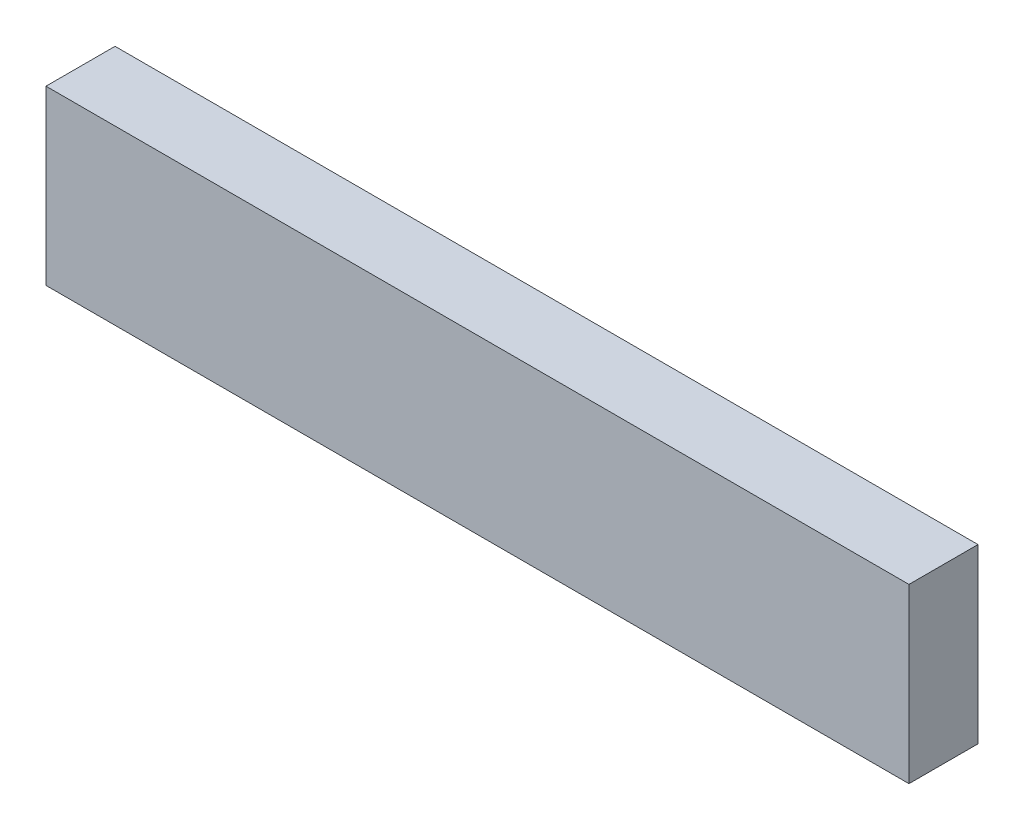
ISO-10303-21;
HEADER;
FILE_DESCRIPTION(('STEP AP214'),'2;1');
FILE_NAME('part.step','',(''),(''),'','','');
FILE_SCHEMA(('AUTOMOTIVE_DESIGN { 1 0 10303 214 1 1 1 1 }'));
ENDSEC;
DATA;
#1=APPLICATION_CONTEXT('core data for automotive mechanical design processes');
#2=APPLICATION_PROTOCOL_DEFINITION('international standard','automotive_design',2000,#1);
#3=PRODUCT_CONTEXT('',#1,'mechanical');
#4=PRODUCT('Part','Part','',(#3));
#5=PRODUCT_RELATED_PRODUCT_CATEGORY('part','',(#4));
#6=PRODUCT_DEFINITION_FORMATION('','',#4);
#7=PRODUCT_DEFINITION_CONTEXT('part definition',#1,'design');
#8=PRODUCT_DEFINITION('design','',#6,#7);
#9=PRODUCT_DEFINITION_SHAPE('','',#8);
#10=(LENGTH_UNIT() NAMED_UNIT(*) SI_UNIT(.MILLI.,.METRE.));
#11=(NAMED_UNIT(*) PLANE_ANGLE_UNIT() SI_UNIT($,.RADIAN.));
#12=(NAMED_UNIT(*) SI_UNIT($,.STERADIAN.) SOLID_ANGLE_UNIT());
#13=UNCERTAINTY_MEASURE_WITH_UNIT(LENGTH_MEASURE(1.E-05),#10,'distance_accuracy_value','');
#14=(GEOMETRIC_REPRESENTATION_CONTEXT(3) GLOBAL_UNCERTAINTY_ASSIGNED_CONTEXT((#13)) GLOBAL_UNIT_ASSIGNED_CONTEXT((#10,
#11,#12)) REPRESENTATION_CONTEXT('',''));
#15=CARTESIAN_POINT('',(0.,0.,0.));
#16=DIRECTION('',(0.,0.,1.));
#17=DIRECTION('',(1.,0.,0.));
#18=AXIS2_PLACEMENT_3D('',#15,#16,#17);
#19=CARTESIAN_POINT('',(125.,-25.,20.));
#20=DIRECTION('',(-1.,0.,0.));
#21=DIRECTION('',(0.,0.,1.));
#22=AXIS2_PLACEMENT_3D('',#19,#20,#21);
#23=PLANE('',#22);
#24=DIRECTION('',(0.,1.,0.));
#25=VECTOR('',#24,1.);
#26=CARTESIAN_POINT('',(125.,-25.,0.));
#27=LINE('',#26,#25);
#28=CARTESIAN_POINT('',(125.,-25.,0.));
#29=VERTEX_POINT('',#28);
#30=CARTESIAN_POINT('',(125.,25.,0.));
#31=VERTEX_POINT('',#30);
#32=EDGE_CURVE('E113',#29,#31,#27,.T.);
#33=ORIENTED_EDGE('',*,*,#32,.T.);
#34=DIRECTION('',(0.,0.,-1.));
#35=VECTOR('',#34,1.);
#36=CARTESIAN_POINT('',(125.,25.,20.));
#37=LINE('',#36,#35);
#38=CARTESIAN_POINT('',(125.,25.,20.));
#39=VERTEX_POINT('',#38);
#40=EDGE_CURVE('E11',#39,#31,#37,.T.);
#41=ORIENTED_EDGE('',*,*,#40,.F.);
#42=DIRECTION('',(0.,1.,0.));
#43=VECTOR('',#42,1.);
#44=CARTESIAN_POINT('',(125.,-25.,20.));
#45=LINE('',#44,#43);
#46=CARTESIAN_POINT('',(125.,-25.,20.));
#47=VERTEX_POINT('',#46);
#48=EDGE_CURVE('E97',#47,#39,#45,.T.);
#49=ORIENTED_EDGE('',*,*,#48,.F.);
#50=DIRECTION('',(0.,0.,-1.));
#51=VECTOR('',#50,1.);
#52=CARTESIAN_POINT('',(125.,-25.,20.));
#53=LINE('',#52,#51);
#54=EDGE_CURVE('E109',#47,#29,#53,.T.);
#55=ORIENTED_EDGE('',*,*,#54,.T.);
#56=EDGE_LOOP('',(#33,#41,#49,#55));
#57=FACE_BOUND('',#56,.T.);
#58=ADVANCED_FACE('F45',(#57),#23,.F.);
#59=CARTESIAN_POINT('',(-125.,25.,20.));
#60=DIRECTION('',(0.,-1.,0.));
#61=DIRECTION('',(0.,0.,-1.));
#62=AXIS2_PLACEMENT_3D('',#59,#60,#61);
#63=PLANE('',#62);
#64=DIRECTION('',(-1.,0.,0.));
#65=VECTOR('',#64,1.);
#66=CARTESIAN_POINT('',(-125.,25.,0.));
#67=LINE('',#66,#65);
#68=CARTESIAN_POINT('',(-125.,25.,0.));
#69=VERTEX_POINT('',#68);
#70=EDGE_CURVE('E102',#31,#69,#67,.T.);
#71=ORIENTED_EDGE('',*,*,#70,.T.);
#72=DIRECTION('',(0.,0.,-1.));
#73=VECTOR('',#72,1.);
#74=CARTESIAN_POINT('',(-125.,25.,20.));
#75=LINE('',#74,#73);
#76=CARTESIAN_POINT('',(-125.,25.,20.));
#77=VERTEX_POINT('',#76);
#78=EDGE_CURVE('E54',#77,#69,#75,.T.);
#79=ORIENTED_EDGE('',*,*,#78,.F.);
#80=DIRECTION('',(-1.,0.,0.));
#81=VECTOR('',#80,1.);
#82=CARTESIAN_POINT('',(-125.,25.,20.));
#83=LINE('',#82,#81);
#84=EDGE_CURVE('E92',#39,#77,#83,.T.);
#85=ORIENTED_EDGE('',*,*,#84,.F.);
#86=ORIENTED_EDGE('',*,*,#40,.T.);
#87=EDGE_LOOP('',(#71,#79,#85,#86));
#88=FACE_BOUND('',#87,.T.);
#89=ADVANCED_FACE('F101',(#88),#63,.F.);
#90=CARTESIAN_POINT('',(-125.,-25.,20.));
#91=DIRECTION('',(1.,0.,0.));
#92=DIRECTION('',(0.,0.,-1.));
#93=AXIS2_PLACEMENT_3D('',#90,#91,#92);
#94=PLANE('',#93);
#95=DIRECTION('',(0.,-1.,0.));
#96=VECTOR('',#95,1.);
#97=CARTESIAN_POINT('',(-125.,-25.,0.));
#98=LINE('',#97,#96);
#99=CARTESIAN_POINT('',(-125.,-25.,0.));
#100=VERTEX_POINT('',#99);
#101=EDGE_CURVE('E79',#69,#100,#98,.T.);
#102=ORIENTED_EDGE('',*,*,#101,.T.);
#103=DIRECTION('',(0.,0.,-1.));
#104=VECTOR('',#103,1.);
#105=CARTESIAN_POINT('',(-125.,-25.,20.));
#106=LINE('',#105,#104);
#107=CARTESIAN_POINT('',(-125.,-25.,20.));
#108=VERTEX_POINT('',#107);
#109=EDGE_CURVE('E104',#108,#100,#106,.T.);
#110=ORIENTED_EDGE('',*,*,#109,.F.);
#111=DIRECTION('',(0.,-1.,0.));
#112=VECTOR('',#111,1.);
#113=CARTESIAN_POINT('',(-125.,-25.,20.));
#114=LINE('',#113,#112);
#115=EDGE_CURVE('E95',#77,#108,#114,.T.);
#116=ORIENTED_EDGE('',*,*,#115,.F.);
#117=ORIENTED_EDGE('',*,*,#78,.T.);
#118=EDGE_LOOP('',(#102,#110,#116,#117));
#119=FACE_BOUND('',#118,.T.);
#120=ADVANCED_FACE('F105',(#119),#94,.F.);
#121=CARTESIAN_POINT('',(-125.,-25.,20.));
#122=DIRECTION('',(0.,1.,0.));
#123=DIRECTION('',(0.,0.,1.));
#124=AXIS2_PLACEMENT_3D('',#121,#122,#123);
#125=PLANE('',#124);
#126=DIRECTION('',(1.,0.,0.));
#127=VECTOR('',#126,1.);
#128=CARTESIAN_POINT('',(-125.,-25.,0.));
#129=LINE('',#128,#127);
#130=EDGE_CURVE('E85',#100,#29,#129,.T.);
#131=ORIENTED_EDGE('',*,*,#130,.T.);
#132=ORIENTED_EDGE('',*,*,#54,.F.);
#133=DIRECTION('',(1.,0.,0.));
#134=VECTOR('',#133,1.);
#135=CARTESIAN_POINT('',(-125.,-25.,20.));
#136=LINE('',#135,#134);
#137=EDGE_CURVE('E62',#108,#47,#136,.T.);
#138=ORIENTED_EDGE('',*,*,#137,.F.);
#139=ORIENTED_EDGE('',*,*,#109,.T.);
#140=EDGE_LOOP('',(#131,#132,#138,#139));
#141=FACE_BOUND('',#140,.T.);
#142=ADVANCED_FACE('F126',(#141),#125,.F.);
#143=CARTESIAN_POINT('',(0.,0.,20.));
#144=DIRECTION('',(0.,0.,-1.));
#145=DIRECTION('',(-1.,0.,0.));
#146=AXIS2_PLACEMENT_3D('',#143,#144,#145);
#147=PLANE('',#146);
#148=ORIENTED_EDGE('',*,*,#48,.T.);
#149=ORIENTED_EDGE('',*,*,#84,.T.);
#150=ORIENTED_EDGE('',*,*,#115,.T.);
#151=ORIENTED_EDGE('',*,*,#137,.T.);
#152=EDGE_LOOP('',(#148,#149,#150,#151));
#153=FACE_BOUND('',#152,.T.);
#154=ADVANCED_FACE('F93',(#153),#147,.F.);
#155=CARTESIAN_POINT('',(0.,0.,0.));
#156=DIRECTION('',(0.,0.,-1.));
#157=DIRECTION('',(-1.,0.,0.));
#158=AXIS2_PLACEMENT_3D('',#155,#156,#157);
#159=PLANE('',#158);
#160=ORIENTED_EDGE('',*,*,#32,.F.);
#161=ORIENTED_EDGE('',*,*,#130,.F.);
#162=ORIENTED_EDGE('',*,*,#101,.F.);
#163=ORIENTED_EDGE('',*,*,#70,.F.);
#164=EDGE_LOOP('',(#160,#161,#162,#163));
#165=FACE_BOUND('',#164,.T.);
#166=ADVANCED_FACE('F129',(#165),#159,.T.);
#167=CLOSED_SHELL('',(#58,#89,#120,#142,#154,#166));
#168=MANIFOLD_SOLID_BREP('B2',#167);
#169=ADVANCED_BREP_SHAPE_REPRESENTATION('',(#18,#168),#14);
#170=SHAPE_DEFINITION_REPRESENTATION(#9,#169);
ENDSEC;
END-ISO-10303-21;
